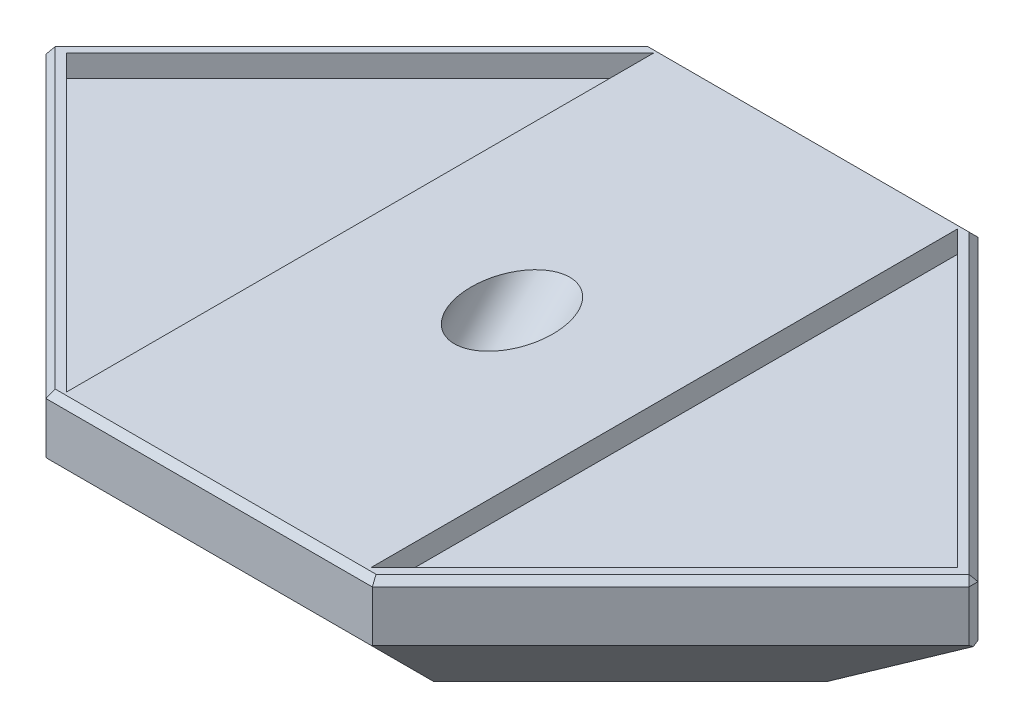
ISO-10303-21;
HEADER;
FILE_DESCRIPTION(('STEP AP214'),'2;1');
FILE_NAME('part.step','',(''),(''),'','','');
FILE_SCHEMA(('AUTOMOTIVE_DESIGN { 1 0 10303 214 1 1 1 1 }'));
ENDSEC;
DATA;
#1=APPLICATION_CONTEXT('core data for automotive mechanical design processes');
#2=APPLICATION_PROTOCOL_DEFINITION('international standard','automotive_design',2000,#1);
#3=PRODUCT_CONTEXT('',#1,'mechanical');
#4=PRODUCT('Part','Part','',(#3));
#5=PRODUCT_RELATED_PRODUCT_CATEGORY('part','',(#4));
#6=PRODUCT_DEFINITION_FORMATION('','',#4);
#7=PRODUCT_DEFINITION_CONTEXT('part definition',#1,'design');
#8=PRODUCT_DEFINITION('design','',#6,#7);
#9=PRODUCT_DEFINITION_SHAPE('','',#8);
#10=(LENGTH_UNIT() NAMED_UNIT(*) SI_UNIT(.MILLI.,.METRE.));
#11=(NAMED_UNIT(*) PLANE_ANGLE_UNIT() SI_UNIT($,.RADIAN.));
#12=(NAMED_UNIT(*) SI_UNIT($,.STERADIAN.) SOLID_ANGLE_UNIT());
#13=UNCERTAINTY_MEASURE_WITH_UNIT(LENGTH_MEASURE(1.E-05),#10,'distance_accuracy_value','');
#14=(GEOMETRIC_REPRESENTATION_CONTEXT(3) GLOBAL_UNCERTAINTY_ASSIGNED_CONTEXT((#13)) GLOBAL_UNIT_ASSIGNED_CONTEXT((#10,
#11,#12)) REPRESENTATION_CONTEXT('',''));
#15=CARTESIAN_POINT('',(0.,0.,0.));
#16=DIRECTION('',(0.,0.,1.));
#17=DIRECTION('',(1.,0.,0.));
#18=AXIS2_PLACEMENT_3D('',#15,#16,#17);
#19=CARTESIAN_POINT('',(0.,50.8,0.));
#20=DIRECTION('',(0.,1.,0.));
#21=DIRECTION('',(0.,0.,1.));
#22=AXIS2_PLACEMENT_3D('',#19,#20,#21);
#23=PLANE('',#22);
#24=CARTESIAN_POINT('',(0.,50.8,25.4000000000001));
#25=DIRECTION('',(0.,1.,0.));
#26=DIRECTION('',(0.,0.,1.));
#27=AXIS2_PLACEMENT_3D('',#24,#25,#26);
#28=ELLIPSE('',#27,5.3881536726415,3.81);
#29=CARTESIAN_POINT('',(-0.57424923983971,50.8,30.7266007566823));
#30=VERTEX_POINT('',#29);
#31=CARTESIAN_POINT('',(0.574249239839723,50.8,30.7266007566823));
#32=VERTEX_POINT('',#31);
#33=EDGE_CURVE('E12',#30,#32,#28,.F.);
#34=ORIENTED_EDGE('',*,*,#33,.F.);
#35=DIRECTION('',(1.,0.,0.));
#36=VECTOR('',#35,1.);
#37=CARTESIAN_POINT('',(0.,50.8,30.7266007566823));
#38=LINE('',#37,#36);
#39=CARTESIAN_POINT('',(-18.4710779641509,50.8,30.7266007566823));
#40=VERTEX_POINT('',#39);
#41=EDGE_CURVE('E215',#40,#30,#38,.T.);
#42=ORIENTED_EDGE('',*,*,#41,.F.);
#43=DIRECTION('',(-0.707106781186547,0.,-0.707106781186548));
#44=VECTOR('',#43,1.);
#45=CARTESIAN_POINT('',(-24.5988393604166,50.8,24.5988393604166));
#46=LINE('',#45,#44);
#47=CARTESIAN_POINT('',(-49.1976787208332,50.8,0.));
#48=VERTEX_POINT('',#47);
#49=EDGE_CURVE('E257',#40,#48,#46,.T.);
#50=ORIENTED_EDGE('',*,*,#49,.T.);
#51=DIRECTION('',(0.707106781186548,0.,-0.707106781186547));
#52=VECTOR('',#51,1.);
#53=CARTESIAN_POINT('',(-24.5988393604166,50.8,-24.5988393604166));
#54=LINE('',#53,#52);
#55=CARTESIAN_POINT('',(-18.4710779641509,50.8,-30.7266007566823));
#56=VERTEX_POINT('',#55);
#57=EDGE_CURVE('E254',#48,#56,#54,.T.);
#58=ORIENTED_EDGE('',*,*,#57,.T.);
#59=DIRECTION('',(-1.,0.,0.));
#60=VECTOR('',#59,1.);
#61=CARTESIAN_POINT('',(0.,50.8,-30.7266007566823));
#62=LINE('',#61,#60);
#63=CARTESIAN_POINT('',(18.4710779641509,50.8,-30.7266007566823));
#64=VERTEX_POINT('',#63);
#65=EDGE_CURVE('E290',#64,#56,#62,.T.);
#66=ORIENTED_EDGE('',*,*,#65,.F.);
#67=DIRECTION('',(0.707106781186547,0.,0.707106781186548));
#68=VECTOR('',#67,1.);
#69=CARTESIAN_POINT('',(24.5988393604166,50.8,-24.5988393604166));
#70=LINE('',#69,#68);
#71=CARTESIAN_POINT('',(49.1976787208331,50.8,0.));
#72=VERTEX_POINT('',#71);
#73=EDGE_CURVE('E249',#64,#72,#70,.T.);
#74=ORIENTED_EDGE('',*,*,#73,.T.);
#75=DIRECTION('',(-0.707106781186548,0.,0.707106781186547));
#76=VECTOR('',#75,1.);
#77=CARTESIAN_POINT('',(24.5988393604166,50.8,24.5988393604166));
#78=LINE('',#77,#76);
#79=CARTESIAN_POINT('',(18.4710779641509,50.8,30.7266007566823));
#80=VERTEX_POINT('',#79);
#81=EDGE_CURVE('E221',#72,#80,#78,.T.);
#82=ORIENTED_EDGE('',*,*,#81,.T.);
#83=EDGE_CURVE('E213',#32,#80,#38,.T.);
#84=ORIENTED_EDGE('',*,*,#83,.F.);
#85=EDGE_LOOP('',(#34,#42,#50,#58,#66,#74,#82,#84));
#86=FACE_BOUND('',#85,.T.);
#87=ADVANCED_FACE('F47',(#86),#23,.F.);
#88=CARTESIAN_POINT('',(0.,99.7731723178066,-23.5731723178066));
#89=DIRECTION('',(0.,-0.707106781186546,0.707106781186549));
#90=DIRECTION('',(0.,-0.707106781186549,-0.707106781186546));
#91=AXIS2_PLACEMENT_3D('',#88,#89,#90);
#92=CYLINDRICAL_SURFACE('',#91,1.905);
#93=CARTESIAN_POINT('',(0.,57.1169557427281,19.083044257272));
#94=DIRECTION('',(0.,0.707106781186546,-0.707106781186549));
#95=DIRECTION('',(0.,0.707106781186549,0.707106781186546));
#96=AXIS2_PLACEMENT_3D('',#93,#94,#95);
#97=CIRCLE('',#96,1.905);
#98=CARTESIAN_POINT('',(0.,58.4639941608884,20.4300826754324));
#99=VERTEX_POINT('',#98);
#100=EDGE_CURVE('E218',#99,#99,#97,.T.);
#101=ORIENTED_EDGE('',*,*,#100,.F.);
#102=EDGE_LOOP('',(#101));
#103=FACE_BOUND('',#102,.T.);
#104=CARTESIAN_POINT('',(0.,66.0972118637972,10.1027881362029));
#105=DIRECTION('',(0.,0.707106781186546,-0.707106781186549));
#106=DIRECTION('',(0.,0.707106781186549,0.707106781186546));
#107=AXIS2_PLACEMENT_3D('',#104,#105,#106);
#108=CIRCLE('',#107,1.905);
#109=CARTESIAN_POINT('',(0.,67.4442502819576,11.4498265543632));
#110=VERTEX_POINT('',#109);
#111=EDGE_CURVE('E396',#110,#110,#108,.T.);
#112=ORIENTED_EDGE('',*,*,#111,.T.);
#113=EDGE_LOOP('',(#112));
#114=FACE_BOUND('',#113,.T.);
#115=ADVANCED_FACE('F560',(#103,#114),#92,.F.);
#116=CARTESIAN_POINT('',(-72.5463446356131,76.2,0.));
#117=DIRECTION('',(0.707106781186547,0.,0.707106781186548));
#118=DIRECTION('',(0.707106781186548,0.,-0.707106781186547));
#119=AXIS2_PLACEMENT_3D('',#116,#117,#118);
#120=PLANE('',#119);
#121=DIRECTION('',(-0.707106781186548,0.,0.707106781186547));
#122=VECTOR('',#121,1.);
#123=CARTESIAN_POINT('',(-72.5463446356131,67.31,0.));
#124=LINE('',#123,#122);
#125=CARTESIAN_POINT('',(-25.4,67.31,-47.146344635613));
#126=VERTEX_POINT('',#125);
#127=CARTESIAN_POINT('',(-71.8392378544265,67.31,-0.707106781186533));
#128=VERTEX_POINT('',#127);
#129=EDGE_CURVE('E261',#126,#128,#124,.T.);
#130=ORIENTED_EDGE('',*,*,#129,.T.);
#131=DIRECTION('',(0.,1.,0.));
#132=VECTOR('',#131,1.);
#133=CARTESIAN_POINT('',(-71.8392378544265,76.2,-0.707106781186533));
#134=LINE('',#133,#132);
#135=CARTESIAN_POINT('',(-71.8392378544265,75.2,-0.707106781186533));
#136=VERTEX_POINT('',#135);
#137=EDGE_CURVE('E311',#128,#136,#134,.T.);
#138=ORIENTED_EDGE('',*,*,#137,.T.);
#139=DIRECTION('',(0.707106781186548,0.,-0.707106781186547));
#140=VECTOR('',#139,1.);
#141=CARTESIAN_POINT('',(-72.5463446356131,75.2,0.));
#142=LINE('',#141,#140);
#143=CARTESIAN_POINT('',(-25.4,75.2,-47.146344635613));
#144=VERTEX_POINT('',#143);
#145=EDGE_CURVE('E308',#136,#144,#142,.T.);
#146=ORIENTED_EDGE('',*,*,#145,.T.);
#147=DIRECTION('',(0.,-1.,0.));
#148=VECTOR('',#147,1.);
#149=CARTESIAN_POINT('',(-25.4,76.2,-47.146344635613));
#150=LINE('',#149,#148);
#151=EDGE_CURVE('E450',#144,#126,#150,.T.);
#152=ORIENTED_EDGE('',*,*,#151,.T.);
#153=EDGE_LOOP('',(#130,#138,#146,#152));
#154=FACE_BOUND('',#153,.T.);
#155=ADVANCED_FACE('F546',(#154),#120,.F.);
#156=CARTESIAN_POINT('',(-25.4,76.2,47.1463446356131));
#157=DIRECTION('',(0.707106781186548,0.,-0.707106781186547));
#158=DIRECTION('',(-0.707106781186547,0.,-0.707106781186548));
#159=AXIS2_PLACEMENT_3D('',#156,#157,#158);
#160=PLANE('',#159);
#161=DIRECTION('',(-0.707106781186547,0.,-0.707106781186548));
#162=VECTOR('',#161,1.);
#163=CARTESIAN_POINT('',(-25.4,75.2,47.1463446356131));
#164=LINE('',#163,#162);
#165=CARTESIAN_POINT('',(-25.4,75.2,47.1463446356131));
#166=VERTEX_POINT('',#165);
#167=CARTESIAN_POINT('',(-71.8392378544265,75.2,0.707106781186519));
#168=VERTEX_POINT('',#167);
#169=EDGE_CURVE('E286',#166,#168,#164,.T.);
#170=ORIENTED_EDGE('',*,*,#169,.T.);
#171=DIRECTION('',(0.,-1.,0.));
#172=VECTOR('',#171,1.);
#173=CARTESIAN_POINT('',(-71.8392378544265,76.2,0.707106781186524));
#174=LINE('',#173,#172);
#175=CARTESIAN_POINT('',(-71.8392378544265,67.31,0.707106781186517));
#176=VERTEX_POINT('',#175);
#177=EDGE_CURVE('E298',#168,#176,#174,.T.);
#178=ORIENTED_EDGE('',*,*,#177,.T.);
#179=DIRECTION('',(0.707106781186547,0.,0.707106781186548));
#180=VECTOR('',#179,1.);
#181=CARTESIAN_POINT('',(-25.4,67.31,47.1463446356131));
#182=LINE('',#181,#180);
#183=CARTESIAN_POINT('',(-25.4,67.31,47.1463446356131));
#184=VERTEX_POINT('',#183);
#185=EDGE_CURVE('E228',#176,#184,#182,.T.);
#186=ORIENTED_EDGE('',*,*,#185,.T.);
#187=DIRECTION('',(0.,-1.,0.));
#188=VECTOR('',#187,1.);
#189=CARTESIAN_POINT('',(-25.4,76.2,47.1463446356131));
#190=LINE('',#189,#188);
#191=EDGE_CURVE('E224',#166,#184,#190,.T.);
#192=ORIENTED_EDGE('',*,*,#191,.F.);
#193=EDGE_LOOP('',(#170,#178,#186,#192));
#194=FACE_BOUND('',#193,.T.);
#195=ADVANCED_FACE('F490',(#194),#160,.F.);
#196=CARTESIAN_POINT('',(25.4,76.2,47.1463446356131));
#197=DIRECTION('',(0.,0.,-1.));
#198=DIRECTION('',(-1.,0.,0.));
#199=AXIS2_PLACEMENT_3D('',#196,#197,#198);
#200=PLANE('',#199);
#201=DIRECTION('',(0.,-1.,0.));
#202=VECTOR('',#201,1.);
#203=CARTESIAN_POINT('',(25.4,76.2,47.1463446356131));
#204=LINE('',#203,#202);
#205=CARTESIAN_POINT('',(25.4,75.2,47.1463446356131));
#206=VERTEX_POINT('',#205);
#207=CARTESIAN_POINT('',(25.4,67.31,47.1463446356131));
#208=VERTEX_POINT('',#207);
#209=EDGE_CURVE('E229',#206,#208,#204,.T.);
#210=ORIENTED_EDGE('',*,*,#209,.F.);
#211=DIRECTION('',(-1.,0.,0.));
#212=VECTOR('',#211,1.);
#213=CARTESIAN_POINT('',(25.4,75.2,47.1463446356131));
#214=LINE('',#213,#212);
#215=EDGE_CURVE('E351',#206,#166,#214,.T.);
#216=ORIENTED_EDGE('',*,*,#215,.T.);
#217=ORIENTED_EDGE('',*,*,#191,.T.);
#218=DIRECTION('',(-0.816496580927727,0.577350269189624,0.));
#219=VECTOR('',#218,1.);
#220=CARTESIAN_POINT('',(-25.4,67.31,47.1463446356131));
#221=LINE('',#220,#219);
#222=CARTESIAN_POINT('',(-25.2723585694968,67.2197438789308,47.1463446356131));
#223=VERTEX_POINT('',#222);
#224=EDGE_CURVE('E240',#184,#223,#221,.F.);
#225=ORIENTED_EDGE('',*,*,#224,.T.);
#226=DIRECTION('',(1.,0.,0.));
#227=VECTOR('',#226,1.);
#228=CARTESIAN_POINT('',(25.4,67.2197438789308,47.1463446356131));
#229=LINE('',#228,#227);
#230=CARTESIAN_POINT('',(25.2723585694968,67.2197438789308,47.1463446356131));
#231=VERTEX_POINT('',#230);
#232=EDGE_CURVE('E442',#223,#231,#229,.T.);
#233=ORIENTED_EDGE('',*,*,#232,.T.);
#234=DIRECTION('',(-0.816496580927728,-0.577350269189624,0.));
#235=VECTOR('',#234,1.);
#236=CARTESIAN_POINT('',(56.8308964237422,89.535,47.1463446356131));
#237=LINE('',#236,#235);
#238=EDGE_CURVE('E236',#231,#208,#237,.F.);
#239=ORIENTED_EDGE('',*,*,#238,.T.);
#240=EDGE_LOOP('',(#210,#216,#217,#225,#233,#239));
#241=FACE_BOUND('',#240,.T.);
#242=ADVANCED_FACE('F465',(#241),#200,.F.);
#243=CARTESIAN_POINT('',(72.5463446356131,76.2,0.));
#244=DIRECTION('',(-0.707106781186547,0.,-0.707106781186548));
#245=DIRECTION('',(-0.707106781186548,0.,0.707106781186547));
#246=AXIS2_PLACEMENT_3D('',#243,#244,#245);
#247=PLANE('',#246);
#248=DIRECTION('',(0.707106781186548,0.,-0.707106781186547));
#249=VECTOR('',#248,1.);
#250=CARTESIAN_POINT('',(72.5463446356131,67.31,0.));
#251=LINE('',#250,#249);
#252=CARTESIAN_POINT('',(71.8392378544265,67.31,0.707106781186547));
#253=VERTEX_POINT('',#252);
#254=EDGE_CURVE('E278',#208,#253,#251,.T.);
#255=ORIENTED_EDGE('',*,*,#254,.T.);
#256=DIRECTION('',(0.,1.,0.));
#257=VECTOR('',#256,1.);
#258=CARTESIAN_POINT('',(71.8392378544265,76.2,0.707106781186547));
#259=LINE('',#258,#257);
#260=CARTESIAN_POINT('',(71.8392378544265,75.2,0.707106781186547));
#261=VERTEX_POINT('',#260);
#262=EDGE_CURVE('E329',#253,#261,#259,.T.);
#263=ORIENTED_EDGE('',*,*,#262,.T.);
#264=DIRECTION('',(-0.707106781186548,0.,0.707106781186547));
#265=VECTOR('',#264,1.);
#266=CARTESIAN_POINT('',(72.5463446356131,75.2,0.));
#267=LINE('',#266,#265);
#268=EDGE_CURVE('E326',#261,#206,#267,.T.);
#269=ORIENTED_EDGE('',*,*,#268,.T.);
#270=ORIENTED_EDGE('',*,*,#209,.T.);
#271=EDGE_LOOP('',(#255,#263,#269,#270));
#272=FACE_BOUND('',#271,.T.);
#273=ADVANCED_FACE('F458',(#272),#247,.F.);
#274=CARTESIAN_POINT('',(25.4,76.2,-47.1463446356131));
#275=DIRECTION('',(-0.707106781186548,0.,0.707106781186547));
#276=DIRECTION('',(0.707106781186547,0.,0.707106781186548));
#277=AXIS2_PLACEMENT_3D('',#274,#275,#276);
#278=PLANE('',#277);
#279=DIRECTION('',(0.707106781186547,0.,0.707106781186548));
#280=VECTOR('',#279,1.);
#281=CARTESIAN_POINT('',(25.4,75.2,-47.1463446356131));
#282=LINE('',#281,#280);
#283=CARTESIAN_POINT('',(25.4,75.2,-47.1463446356131));
#284=VERTEX_POINT('',#283);
#285=CARTESIAN_POINT('',(71.8392378544265,75.2,-0.707106781186505));
#286=VERTEX_POINT('',#285);
#287=EDGE_CURVE('E314',#284,#286,#282,.T.);
#288=ORIENTED_EDGE('',*,*,#287,.T.);
#289=DIRECTION('',(0.,-1.,0.));
#290=VECTOR('',#289,1.);
#291=CARTESIAN_POINT('',(71.8392378544265,76.2,-0.70710678118651));
#292=LINE('',#291,#290);
#293=CARTESIAN_POINT('',(71.8392378544265,67.31,-0.707106781186503));
#294=VERTEX_POINT('',#293);
#295=EDGE_CURVE('E317',#286,#294,#292,.T.);
#296=ORIENTED_EDGE('',*,*,#295,.T.);
#297=DIRECTION('',(-0.707106781186547,0.,-0.707106781186548));
#298=VECTOR('',#297,1.);
#299=CARTESIAN_POINT('',(25.4,67.31,-47.1463446356131));
#300=LINE('',#299,#298);
#301=CARTESIAN_POINT('',(25.4,67.31,-47.1463446356131));
#302=VERTEX_POINT('',#301);
#303=EDGE_CURVE('E282',#294,#302,#300,.T.);
#304=ORIENTED_EDGE('',*,*,#303,.T.);
#305=DIRECTION('',(0.,-1.,0.));
#306=VECTOR('',#305,1.);
#307=CARTESIAN_POINT('',(25.4,76.2,-47.1463446356131));
#308=LINE('',#307,#306);
#309=EDGE_CURVE('E453',#284,#302,#308,.T.);
#310=ORIENTED_EDGE('',*,*,#309,.F.);
#311=EDGE_LOOP('',(#288,#296,#304,#310));
#312=FACE_BOUND('',#311,.T.);
#313=ADVANCED_FACE('F507',(#312),#278,.F.);
#314=CARTESIAN_POINT('',(-25.4,76.2,-47.146344635613));
#315=DIRECTION('',(0.,0.,1.));
#316=DIRECTION('',(1.,0.,0.));
#317=AXIS2_PLACEMENT_3D('',#314,#315,#316);
#318=PLANE('',#317);
#319=ORIENTED_EDGE('',*,*,#151,.F.);
#320=DIRECTION('',(1.,0.,0.));
#321=VECTOR('',#320,1.);
#322=CARTESIAN_POINT('',(-25.4,75.2,-47.146344635613));
#323=LINE('',#322,#321);
#324=EDGE_CURVE('E57',#144,#284,#323,.T.);
#325=ORIENTED_EDGE('',*,*,#324,.T.);
#326=ORIENTED_EDGE('',*,*,#309,.T.);
#327=DIRECTION('',(0.816496580927727,0.577350269189624,0.));
#328=VECTOR('',#327,1.);
#329=CARTESIAN_POINT('',(25.4,67.31,-47.1463446356131));
#330=LINE('',#329,#328);
#331=CARTESIAN_POINT('',(25.2723585694968,67.2197438789308,-47.1463446356131));
#332=VERTEX_POINT('',#331);
#333=EDGE_CURVE('E271',#302,#332,#330,.F.);
#334=ORIENTED_EDGE('',*,*,#333,.T.);
#335=DIRECTION('',(-1.,0.,0.));
#336=VECTOR('',#335,1.);
#337=CARTESIAN_POINT('',(-25.4,67.2197438789308,-47.146344635613));
#338=LINE('',#337,#336);
#339=CARTESIAN_POINT('',(-25.2723585694968,67.2197438789308,-47.146344635613));
#340=VERTEX_POINT('',#339);
#341=EDGE_CURVE('E446',#332,#340,#338,.T.);
#342=ORIENTED_EDGE('',*,*,#341,.T.);
#343=DIRECTION('',(0.816496580927727,-0.577350269189624,0.));
#344=VECTOR('',#343,1.);
#345=CARTESIAN_POINT('',(-56.8308964237421,89.535,-47.146344635613));
#346=LINE('',#345,#344);
#347=EDGE_CURVE('E274',#340,#126,#346,.F.);
#348=ORIENTED_EDGE('',*,*,#347,.T.);
#349=EDGE_LOOP('',(#319,#325,#326,#334,#342,#348));
#350=FACE_BOUND('',#349,.T.);
#351=ADVANCED_FACE('F544',(#350),#318,.F.);
#352=CARTESIAN_POINT('',(0.,76.2,0.));
#353=DIRECTION('',(0.,-1.,0.));
#354=DIRECTION('',(0.,0.,-1.));
#355=AXIS2_PLACEMENT_3D('',#352,#353,#354);
#356=PLANE('',#355);
#357=CARTESIAN_POINT('',(0.,76.2,0.));
#358=DIRECTION('',(0.,-1.,0.));
#359=DIRECTION('',(0.,0.,1.));
#360=AXIS2_PLACEMENT_3D('',#357,#358,#359);
#361=ELLIPSE('',#360,8.98025612106917,6.35);
#362=CARTESIAN_POINT('',(0.,76.2,8.98025612106919));
#363=VERTEX_POINT('',#362);
#364=EDGE_CURVE('E399',#363,#363,#361,.F.);
#365=ORIENTED_EDGE('',*,*,#364,.F.);
#366=EDGE_LOOP('',(#365));
#367=FACE_BOUND('',#366,.T.);
#368=DIRECTION('',(-0.707106781186548,0.,0.707106781186547));
#369=VECTOR('',#368,1.);
#370=CARTESIAN_POINT('',(-23.6827588496726,76.2,-45.681605270601));
#371=LINE('',#370,#369);
#372=CARTESIAN_POINT('',(-23.6827588496726,76.2,-45.681605270601));
#373=VERTEX_POINT('',#372);
#374=CARTESIAN_POINT('',(-69.3643641202736,76.2,0.));
#375=VERTEX_POINT('',#374);
#376=EDGE_CURVE('E996',#373,#375,#371,.T.);
#377=ORIENTED_EDGE('',*,*,#376,.F.);
#378=DIRECTION('',(-5.98392186298375E-08,0.,-0.999999999999998));
#379=VECTOR('',#378,1.);
#380=CARTESIAN_POINT('',(-23.6827533825691,76.2,45.6816107377041));
#381=LINE('',#380,#379);
#382=CARTESIAN_POINT('',(-23.6827533825691,76.2,45.6816107377041));
#383=VERTEX_POINT('',#382);
#384=EDGE_CURVE('E70',#383,#373,#381,.T.);
#385=ORIENTED_EDGE('',*,*,#384,.F.);
#386=DIRECTION('',(0.70710678118655,0.,0.707106781186545));
#387=VECTOR('',#386,1.);
#388=CARTESIAN_POINT('',(-69.3643641202736,76.2,0.));
#389=LINE('',#388,#387);
#390=EDGE_CURVE('E985',#375,#383,#389,.T.);
#391=ORIENTED_EDGE('',*,*,#390,.F.);
#392=EDGE_LOOP('',(#377,#385,#391));
#393=FACE_BOUND('',#392,.T.);
#394=DIRECTION('',(-0.70710678118655,0.,-0.707106781186545));
#395=VECTOR('',#394,1.);
#396=CARTESIAN_POINT('',(69.3643641202737,76.2,0.));
#397=LINE('',#396,#395);
#398=CARTESIAN_POINT('',(69.3643641202737,76.2,0.));
#399=VERTEX_POINT('',#398);
#400=CARTESIAN_POINT('',(23.6827561990909,76.2,-45.6816079211824));
#401=VERTEX_POINT('',#400);
#402=EDGE_CURVE('E420',#399,#401,#397,.T.);
#403=ORIENTED_EDGE('',*,*,#402,.F.);
#404=DIRECTION('',(0.707106781186547,0.,-0.707106781186548));
#405=VECTOR('',#404,1.);
#406=CARTESIAN_POINT('',(23.6827452224931,76.2,45.6816188977806));
#407=LINE('',#406,#405);
#408=CARTESIAN_POINT('',(23.6827452224931,76.2,45.6816188977806));
#409=VERTEX_POINT('',#408);
#410=EDGE_CURVE('E425',#409,#399,#407,.T.);
#411=ORIENTED_EDGE('',*,*,#410,.F.);
#412=DIRECTION('',(-1.20142404341E-07,0.,0.999999999999993));
#413=VECTOR('',#412,1.);
#414=CARTESIAN_POINT('',(23.6827561990909,76.2,-45.6816079211824));
#415=LINE('',#414,#413);
#416=EDGE_CURVE('E417',#401,#409,#415,.T.);
#417=ORIENTED_EDGE('',*,*,#416,.F.);
#418=EDGE_LOOP('',(#403,#411,#417));
#419=FACE_BOUND('',#418,.T.);
#420=DIRECTION('',(1.,0.,0.));
#421=VECTOR('',#420,1.);
#422=CARTESIAN_POINT('',(0.,76.2,46.1463446356131));
#423=LINE('',#422,#421);
#424=CARTESIAN_POINT('',(-24.9857864376269,76.2,46.1463446356131));
#425=VERTEX_POINT('',#424);
#426=CARTESIAN_POINT('',(24.9857864376269,76.2,46.1463446356131));
#427=VERTEX_POINT('',#426);
#428=EDGE_CURVE('E344',#425,#427,#423,.T.);
#429=ORIENTED_EDGE('',*,*,#428,.T.);
#430=DIRECTION('',(0.707106781186548,0.,-0.707106781186547));
#431=VECTOR('',#430,1.);
#432=CARTESIAN_POINT('',(35.56606553662,76.2,35.56606553662));
#433=LINE('',#432,#431);
#434=CARTESIAN_POINT('',(71.13213107324,76.2,0.));
#435=VERTEX_POINT('',#434);
#436=EDGE_CURVE('E347',#427,#435,#433,.T.);
#437=ORIENTED_EDGE('',*,*,#436,.T.);
#438=DIRECTION('',(-0.707106781186547,0.,-0.707106781186548));
#439=VECTOR('',#438,1.);
#440=CARTESIAN_POINT('',(35.56606553662,76.2,-35.56606553662));
#441=LINE('',#440,#439);
#442=CARTESIAN_POINT('',(24.9857864376269,76.2,-46.1463446356131));
#443=VERTEX_POINT('',#442);
#444=EDGE_CURVE('E332',#435,#443,#441,.T.);
#445=ORIENTED_EDGE('',*,*,#444,.T.);
#446=DIRECTION('',(-1.,0.,0.));
#447=VECTOR('',#446,1.);
#448=CARTESIAN_POINT('',(0.,76.2,-46.1463446356131));
#449=LINE('',#448,#447);
#450=CARTESIAN_POINT('',(-24.9857864376269,76.2,-46.1463446356131));
#451=VERTEX_POINT('',#450);
#452=EDGE_CURVE('E335',#443,#451,#449,.T.);
#453=ORIENTED_EDGE('',*,*,#452,.T.);
#454=DIRECTION('',(-0.707106781186548,0.,0.707106781186547));
#455=VECTOR('',#454,1.);
#456=CARTESIAN_POINT('',(-35.56606553662,76.2,-35.56606553662));
#457=LINE('',#456,#455);
#458=CARTESIAN_POINT('',(-71.13213107324,76.2,0.));
#459=VERTEX_POINT('',#458);
#460=EDGE_CURVE('E338',#451,#459,#457,.T.);
#461=ORIENTED_EDGE('',*,*,#460,.T.);
#462=DIRECTION('',(0.707106781186547,0.,0.707106781186548));
#463=VECTOR('',#462,1.);
#464=CARTESIAN_POINT('',(-35.56606553662,76.2,35.56606553662));
#465=LINE('',#464,#463);
#466=EDGE_CURVE('E341',#459,#425,#465,.T.);
#467=ORIENTED_EDGE('',*,*,#466,.T.);
#468=EDGE_LOOP('',(#429,#437,#445,#453,#461,#467));
#469=FACE_BOUND('',#468,.T.);
#470=ADVANCED_FACE('F519',(#367,#393,#419,#469),#356,.F.);
#471=CARTESIAN_POINT('',(0.,10.0366996216588,10.0366996216588));
#472=DIRECTION('',(0.,0.707106781186546,0.707106781186549));
#473=DIRECTION('',(0.,-0.707106781186549,0.707106781186546));
#474=AXIS2_PLACEMENT_3D('',#471,#472,#473);
#475=PLANE('',#474);
#476=ORIENTED_EDGE('',*,*,#65,.T.);
#477=DIRECTION('',(0.281084637714826,-0.678598344545847,0.678598344545845));
#478=VECTOR('',#477,1.);
#479=CARTESIAN_POINT('',(-20.0317624695153,54.5678256994361,-34.4944264561184));
#480=LINE('',#479,#478);
#481=EDGE_CURVE('E268',#56,#340,#480,.F.);
#482=ORIENTED_EDGE('',*,*,#481,.T.);
#483=ORIENTED_EDGE('',*,*,#341,.F.);
#484=DIRECTION('',(0.281084637714827,0.678598344545847,-0.678598344545844));
#485=VECTOR('',#484,1.);
#486=CARTESIAN_POINT('',(25.2996591115797,67.2856532178875,-47.2122539745698));
#487=LINE('',#486,#485);
#488=EDGE_CURVE('E265',#332,#64,#487,.F.);
#489=ORIENTED_EDGE('',*,*,#488,.T.);
#490=EDGE_LOOP('',(#476,#482,#483,#489));
#491=FACE_BOUND('',#490,.T.);
#492=ADVANCED_FACE('F540',(#491),#475,.F.);
#493=CARTESIAN_POINT('',(0.,10.0366996216588,-10.0366996216588));
#494=DIRECTION('',(0.,0.707106781186546,-0.707106781186549));
#495=DIRECTION('',(0.,0.707106781186549,0.707106781186546));
#496=AXIS2_PLACEMENT_3D('',#493,#494,#495);
#497=PLANE('',#496);
#498=CARTESIAN_POINT('',(0.,48.1366996216589,28.0633003783412));
#499=DIRECTION('',(0.,0.707106781186546,-0.707106781186549));
#500=DIRECTION('',(0.,0.707106781186549,0.707106781186546));
#501=AXIS2_PLACEMENT_3D('',#498,#499,#500);
#502=CIRCLE('',#501,3.81);
#503=EDGE_CURVE('E62',#30,#32,#502,.T.);
#504=ORIENTED_EDGE('',*,*,#503,.T.);
#505=ORIENTED_EDGE('',*,*,#83,.T.);
#506=DIRECTION('',(-0.281084637714827,-0.678598344545847,-0.678598344545844));
#507=VECTOR('',#506,1.);
#508=CARTESIAN_POINT('',(20.0317624695153,54.5678256994362,34.4944264561185));
#509=LINE('',#508,#507);
#510=EDGE_CURVE('E243',#80,#231,#509,.F.);
#511=ORIENTED_EDGE('',*,*,#510,.T.);
#512=ORIENTED_EDGE('',*,*,#232,.F.);
#513=DIRECTION('',(-0.281084637714827,0.678598344545847,0.678598344545844));
#514=VECTOR('',#513,1.);
#515=CARTESIAN_POINT('',(-25.2996591115797,67.2856532178875,47.2122539745698));
#516=LINE('',#515,#514);
#517=EDGE_CURVE('E246',#223,#40,#516,.F.);
#518=ORIENTED_EDGE('',*,*,#517,.T.);
#519=ORIENTED_EDGE('',*,*,#41,.T.);
#520=EDGE_LOOP('',(#504,#505,#511,#512,#518,#519));
#521=FACE_BOUND('',#520,.T.);
#522=ADVANCED_FACE('F212',(#521),#497,.F.);
#523=CARTESIAN_POINT('',(-72.5463446356131,67.31,0.));
#524=DIRECTION('',(0.499999999999999,0.707106781186549,0.499999999999999));
#525=DIRECTION('',(-0.707106781186548,0.,0.707106781186547));
#526=AXIS2_PLACEMENT_3D('',#523,#524,#525);
#527=PLANE('',#526);
#528=DIRECTION('',(-0.816496580927727,0.577350269189624,0.));
#529=VECTOR('',#528,1.);
#530=CARTESIAN_POINT('',(-72.5463446356131,67.31,0.));
#531=LINE('',#530,#529);
#532=CARTESIAN_POINT('',(-71.8392378544265,66.81,0.));
#533=VERTEX_POINT('',#532);
#534=EDGE_CURVE('E287',#533,#48,#531,.F.);
#535=ORIENTED_EDGE('',*,*,#534,.F.);
#536=DIRECTION('',(0.,0.577350269189625,-0.816496580927727));
#537=VECTOR('',#536,1.);
#538=CARTESIAN_POINT('',(-71.8392378544265,66.9766666666667,-0.235702260395511));
#539=LINE('',#538,#537);
#540=EDGE_CURVE('E305',#533,#128,#539,.T.);
#541=ORIENTED_EDGE('',*,*,#540,.T.);
#542=ORIENTED_EDGE('',*,*,#129,.F.);
#543=ORIENTED_EDGE('',*,*,#347,.F.);
#544=ORIENTED_EDGE('',*,*,#481,.F.);
#545=ORIENTED_EDGE('',*,*,#57,.F.);
#546=EDGE_LOOP('',(#535,#541,#542,#543,#544,#545));
#547=FACE_BOUND('',#546,.T.);
#548=ADVANCED_FACE('F534',(#547),#527,.F.);
#549=CARTESIAN_POINT('',(-25.4,67.31,47.1463446356131));
#550=DIRECTION('',(0.499999999999999,0.707106781186549,-0.499999999999999));
#551=DIRECTION('',(0.707106781186547,0.,0.707106781186548));
#552=AXIS2_PLACEMENT_3D('',#549,#550,#551);
#553=PLANE('',#552);
#554=ORIENTED_EDGE('',*,*,#185,.F.);
#555=DIRECTION('',(0.,-0.577350269189624,-0.816496580927727));
#556=VECTOR('',#555,1.);
#557=CARTESIAN_POINT('',(-71.8392378544265,89.2016666666667,31.6665986841376));
#558=LINE('',#557,#556);
#559=EDGE_CURVE('E302',#176,#533,#558,.T.);
#560=ORIENTED_EDGE('',*,*,#559,.T.);
#561=ORIENTED_EDGE('',*,*,#534,.T.);
#562=ORIENTED_EDGE('',*,*,#49,.F.);
#563=ORIENTED_EDGE('',*,*,#517,.F.);
#564=ORIENTED_EDGE('',*,*,#224,.F.);
#565=EDGE_LOOP('',(#554,#560,#561,#562,#563,#564));
#566=FACE_BOUND('',#565,.T.);
#567=ADVANCED_FACE('F497',(#566),#553,.F.);
#568=CARTESIAN_POINT('',(25.4,67.31,-47.1463446356131));
#569=DIRECTION('',(-0.499999999999999,0.707106781186549,0.499999999999999));
#570=DIRECTION('',(-0.707106781186547,0.,-0.707106781186548));
#571=AXIS2_PLACEMENT_3D('',#568,#569,#570);
#572=PLANE('',#571);
#573=ORIENTED_EDGE('',*,*,#303,.F.);
#574=DIRECTION('',(0.,-0.577350269189624,0.816496580927727));
#575=VECTOR('',#574,1.);
#576=CARTESIAN_POINT('',(71.8392378544265,89.2016666666667,-31.6665986841376));
#577=LINE('',#576,#575);
#578=CARTESIAN_POINT('',(71.8392378544265,66.81,0.));
#579=VERTEX_POINT('',#578);
#580=EDGE_CURVE('E320',#294,#579,#577,.T.);
#581=ORIENTED_EDGE('',*,*,#580,.T.);
#582=DIRECTION('',(-0.816496580927727,-0.577350269189624,0.));
#583=VECTOR('',#582,1.);
#584=CARTESIAN_POINT('',(41.1154482118709,45.085,0.));
#585=LINE('',#584,#583);
#586=EDGE_CURVE('E291',#72,#579,#585,.F.);
#587=ORIENTED_EDGE('',*,*,#586,.F.);
#588=ORIENTED_EDGE('',*,*,#73,.F.);
#589=ORIENTED_EDGE('',*,*,#488,.F.);
#590=ORIENTED_EDGE('',*,*,#333,.F.);
#591=EDGE_LOOP('',(#573,#581,#587,#588,#589,#590));
#592=FACE_BOUND('',#591,.T.);
#593=ADVANCED_FACE('F502',(#592),#572,.F.);
#594=CARTESIAN_POINT('',(72.5463446356131,67.31,0.));
#595=DIRECTION('',(-0.499999999999999,0.707106781186549,-0.499999999999999));
#596=DIRECTION('',(0.707106781186548,0.,-0.707106781186547));
#597=AXIS2_PLACEMENT_3D('',#594,#595,#596);
#598=PLANE('',#597);
#599=ORIENTED_EDGE('',*,*,#586,.T.);
#600=DIRECTION('',(0.,0.577350269189624,0.816496580927727));
#601=VECTOR('',#600,1.);
#602=CARTESIAN_POINT('',(71.8392378544265,66.9766666666667,0.235702260395525));
#603=LINE('',#602,#601);
#604=EDGE_CURVE('E323',#579,#253,#603,.T.);
#605=ORIENTED_EDGE('',*,*,#604,.T.);
#606=ORIENTED_EDGE('',*,*,#254,.F.);
#607=ORIENTED_EDGE('',*,*,#238,.F.);
#608=ORIENTED_EDGE('',*,*,#510,.F.);
#609=ORIENTED_EDGE('',*,*,#81,.F.);
#610=EDGE_LOOP('',(#599,#605,#606,#607,#608,#609));
#611=FACE_BOUND('',#610,.T.);
#612=ADVANCED_FACE('F468',(#611),#598,.F.);
#613=CARTESIAN_POINT('',(71.8392378544265,76.2,-0.70710678118651));
#614=DIRECTION('',(-1.,0.,0.));
#615=DIRECTION('',(0.,-1.,0.));
#616=AXIS2_PLACEMENT_3D('',#613,#614,#615);
#617=PLANE('',#616);
#618=DIRECTION('',(0.,0.,1.));
#619=VECTOR('',#618,1.);
#620=CARTESIAN_POINT('',(71.8392378544265,75.2,0.707106781186547));
#621=LINE('',#620,#619);
#622=EDGE_CURVE('E295',#261,#286,#621,.F.);
#623=ORIENTED_EDGE('',*,*,#622,.F.);
#624=ORIENTED_EDGE('',*,*,#262,.F.);
#625=ORIENTED_EDGE('',*,*,#604,.F.);
#626=ORIENTED_EDGE('',*,*,#580,.F.);
#627=ORIENTED_EDGE('',*,*,#295,.F.);
#628=EDGE_LOOP('',(#623,#624,#625,#626,#627));
#629=FACE_BOUND('',#628,.T.);
#630=ADVANCED_FACE('F50',(#629),#617,.F.);
#631=CARTESIAN_POINT('',(71.8392378544265,75.2,0.707106781186547));
#632=DIRECTION('',(0.816496580927732,0.577350269189617,0.));
#633=DIRECTION('',(-0.577350269189617,0.816496580927732,0.));
#634=AXIS2_PLACEMENT_3D('',#631,#632,#633);
#635=PLANE('',#634);
#636=DIRECTION('',(-0.499999999999994,0.70710678118655,-0.500000000000003));
#637=VECTOR('',#636,1.);
#638=CARTESIAN_POINT('',(71.8392378544265,75.2,0.707106781186552));
#639=LINE('',#638,#637);
#640=EDGE_CURVE('E385',#261,#435,#639,.T.);
#641=ORIENTED_EDGE('',*,*,#640,.F.);
#642=ORIENTED_EDGE('',*,*,#622,.T.);
#643=DIRECTION('',(0.499999999999985,-0.707106781186547,-0.500000000000015));
#644=VECTOR('',#643,1.);
#645=CARTESIAN_POINT('',(71.4856844638333,75.7,-0.353553390593228));
#646=LINE('',#645,#644);
#647=EDGE_CURVE('E389',#435,#286,#646,.T.);
#648=ORIENTED_EDGE('',*,*,#647,.F.);
#649=EDGE_LOOP('',(#641,#642,#648));
#650=FACE_BOUND('',#649,.T.);
#651=ADVANCED_FACE('F478',(#650),#635,.T.);
#652=CARTESIAN_POINT('',(35.56606553662,76.2,-35.56606553662));
#653=DIRECTION('',(-0.5,-0.707106781186548,0.5));
#654=DIRECTION('',(-0.707106781186547,0.,-0.707106781186548));
#655=AXIS2_PLACEMENT_3D('',#652,#653,#654);
#656=PLANE('',#655);
#657=ORIENTED_EDGE('',*,*,#647,.T.);
#658=ORIENTED_EDGE('',*,*,#287,.F.);
#659=DIRECTION('',(-0.281084637714828,0.678598344545849,0.678598344545842));
#660=VECTOR('',#659,1.);
#661=CARTESIAN_POINT('',(23.8035989919519,79.0540529646158,-43.2922916709973));
#662=LINE('',#661,#660);
#663=EDGE_CURVE('E381',#443,#284,#662,.F.);
#664=ORIENTED_EDGE('',*,*,#663,.F.);
#665=ORIENTED_EDGE('',*,*,#444,.F.);
#666=EDGE_LOOP('',(#657,#658,#664,#665));
#667=FACE_BOUND('',#666,.T.);
#668=ADVANCED_FACE('F511',(#667),#656,.F.);
#669=CARTESIAN_POINT('',(35.56606553662,76.2,35.56606553662));
#670=DIRECTION('',(-0.500000000000002,-0.707106781186545,-0.500000000000002));
#671=DIRECTION('',(0.707106781186548,0.,-0.707106781186547));
#672=AXIS2_PLACEMENT_3D('',#669,#670,#671);
#673=PLANE('',#672);
#674=ORIENTED_EDGE('',*,*,#640,.T.);
#675=ORIENTED_EDGE('',*,*,#436,.F.);
#676=DIRECTION('',(-0.281084637714822,0.67859834454585,-0.678598344545843));
#677=VECTOR('',#676,1.);
#678=CARTESIAN_POINT('',(23.0116950919334,80.9658781001366,41.3804665354765));
#679=LINE('',#678,#677);
#680=EDGE_CURVE('E377',#206,#427,#679,.T.);
#681=ORIENTED_EDGE('',*,*,#680,.F.);
#682=ORIENTED_EDGE('',*,*,#268,.F.);
#683=EDGE_LOOP('',(#674,#675,#681,#682));
#684=FACE_BOUND('',#683,.T.);
#685=ADVANCED_FACE('F481',(#684),#673,.F.);
#686=CARTESIAN_POINT('',(0.,76.2,-46.1463446356131));
#687=DIRECTION('',(0.,-0.707106781186544,0.707106781186551));
#688=DIRECTION('',(-1.,0.,0.));
#689=AXIS2_PLACEMENT_3D('',#686,#687,#688);
#690=PLANE('',#689);
#691=ORIENTED_EDGE('',*,*,#663,.T.);
#692=ORIENTED_EDGE('',*,*,#324,.F.);
#693=DIRECTION('',(0.281084637714819,0.678598344545851,0.678598344545844));
#694=VECTOR('',#693,1.);
#695=CARTESIAN_POINT('',(-23.0116950919334,80.9658781001366,-41.3804665354765));
#696=LINE('',#695,#694);
#697=EDGE_CURVE('E373',#451,#144,#696,.F.);
#698=ORIENTED_EDGE('',*,*,#697,.F.);
#699=ORIENTED_EDGE('',*,*,#452,.F.);
#700=EDGE_LOOP('',(#691,#692,#698,#699));
#701=FACE_BOUND('',#700,.T.);
#702=ADVANCED_FACE('F515',(#701),#690,.F.);
#703=CARTESIAN_POINT('',(0.,76.2,46.1463446356131));
#704=DIRECTION('',(0.,-0.707106781186544,-0.707106781186551));
#705=DIRECTION('',(1.,0.,0.));
#706=AXIS2_PLACEMENT_3D('',#703,#704,#705);
#707=PLANE('',#706);
#708=ORIENTED_EDGE('',*,*,#680,.T.);
#709=ORIENTED_EDGE('',*,*,#428,.F.);
#710=DIRECTION('',(0.281084637714824,0.67859834454585,-0.678598344545843));
#711=VECTOR('',#710,1.);
#712=CARTESIAN_POINT('',(-23.8035989919519,79.0540529646158,43.2922916709973));
#713=LINE('',#712,#711);
#714=EDGE_CURVE('E369',#166,#425,#713,.T.);
#715=ORIENTED_EDGE('',*,*,#714,.F.);
#716=ORIENTED_EDGE('',*,*,#215,.F.);
#717=EDGE_LOOP('',(#708,#709,#715,#716));
#718=FACE_BOUND('',#717,.T.);
#719=ADVANCED_FACE('F486',(#718),#707,.F.);
#720=CARTESIAN_POINT('',(-35.56606553662,76.2,-35.56606553662));
#721=DIRECTION('',(0.500000000000003,-0.707106781186544,0.500000000000003));
#722=DIRECTION('',(-0.707106781186548,0.,0.707106781186547));
#723=AXIS2_PLACEMENT_3D('',#720,#721,#722);
#724=PLANE('',#723);
#725=ORIENTED_EDGE('',*,*,#697,.T.);
#726=ORIENTED_EDGE('',*,*,#145,.F.);
#727=DIRECTION('',(0.500000000000004,0.707106781186551,0.49999999999999));
#728=VECTOR('',#727,1.);
#729=CARTESIAN_POINT('',(-71.8392378544265,75.2,-0.707106781186528));
#730=LINE('',#729,#728);
#731=EDGE_CURVE('E365',#459,#136,#730,.F.);
#732=ORIENTED_EDGE('',*,*,#731,.F.);
#733=ORIENTED_EDGE('',*,*,#460,.F.);
#734=EDGE_LOOP('',(#725,#726,#732,#733));
#735=FACE_BOUND('',#734,.T.);
#736=ADVANCED_FACE('F549',(#735),#724,.F.);
#737=CARTESIAN_POINT('',(-35.56606553662,76.2,35.56606553662));
#738=DIRECTION('',(0.500000000000001,-0.707106781186546,-0.500000000000001));
#739=DIRECTION('',(0.707106781186547,0.,0.707106781186548));
#740=AXIS2_PLACEMENT_3D('',#737,#738,#739);
#741=PLANE('',#740);
#742=ORIENTED_EDGE('',*,*,#714,.T.);
#743=ORIENTED_EDGE('',*,*,#466,.F.);
#744=DIRECTION('',(-0.500000000000003,-0.70710678118655,0.499999999999994));
#745=VECTOR('',#744,1.);
#746=CARTESIAN_POINT('',(-71.4856844638333,75.7,0.35355339059327));
#747=LINE('',#746,#745);
#748=EDGE_CURVE('E360',#168,#459,#747,.F.);
#749=ORIENTED_EDGE('',*,*,#748,.F.);
#750=ORIENTED_EDGE('',*,*,#169,.F.);
#751=EDGE_LOOP('',(#742,#743,#749,#750));
#752=FACE_BOUND('',#751,.T.);
#753=ADVANCED_FACE('F522',(#752),#741,.F.);
#754=CARTESIAN_POINT('',(-71.8392378544265,75.2,-0.707106781186533));
#755=DIRECTION('',(-0.816496580927725,0.577350269189627,0.));
#756=DIRECTION('',(-0.577350269189627,-0.816496580927725,0.));
#757=AXIS2_PLACEMENT_3D('',#754,#755,#756);
#758=PLANE('',#757);
#759=ORIENTED_EDGE('',*,*,#748,.T.);
#760=ORIENTED_EDGE('',*,*,#731,.T.);
#761=DIRECTION('',(0.,0.,-1.));
#762=VECTOR('',#761,1.);
#763=CARTESIAN_POINT('',(-71.8392378544265,75.2,-0.707106781186533));
#764=LINE('',#763,#762);
#765=EDGE_CURVE('E356',#168,#136,#764,.T.);
#766=ORIENTED_EDGE('',*,*,#765,.F.);
#767=EDGE_LOOP('',(#759,#760,#766));
#768=FACE_BOUND('',#767,.T.);
#769=ADVANCED_FACE('F526',(#768),#758,.T.);
#770=CARTESIAN_POINT('',(-71.8392378544265,76.2,0.707106781186524));
#771=DIRECTION('',(1.,0.,0.));
#772=DIRECTION('',(0.,-1.,0.));
#773=AXIS2_PLACEMENT_3D('',#770,#771,#772);
#774=PLANE('',#773);
#775=ORIENTED_EDGE('',*,*,#765,.T.);
#776=ORIENTED_EDGE('',*,*,#137,.F.);
#777=ORIENTED_EDGE('',*,*,#540,.F.);
#778=ORIENTED_EDGE('',*,*,#559,.F.);
#779=ORIENTED_EDGE('',*,*,#177,.F.);
#780=EDGE_LOOP('',(#775,#776,#777,#778,#779));
#781=FACE_BOUND('',#780,.T.);
#782=ADVANCED_FACE('F529',(#781),#774,.F.);
#783=CARTESIAN_POINT('',(23.6827452224931,72.775,45.6816188977806));
#784=DIRECTION('',(0.707106781186548,0.,0.707106781186547));
#785=DIRECTION('',(0.707106781186547,0.,-0.707106781186548));
#786=AXIS2_PLACEMENT_3D('',#783,#784,#785);
#787=PLANE('',#786);
#788=ORIENTED_EDGE('',*,*,#410,.T.);
#789=DIRECTION('',(0.,1.,0.));
#790=VECTOR('',#789,1.);
#791=CARTESIAN_POINT('',(69.3643641202737,72.775,0.));
#792=LINE('',#791,#790);
#793=CARTESIAN_POINT('',(69.3643641202737,72.775,0.));
#794=VERTEX_POINT('',#793);
#795=EDGE_CURVE('E413',#794,#399,#792,.T.);
#796=ORIENTED_EDGE('',*,*,#795,.F.);
#797=DIRECTION('',(0.707106781186547,0.,-0.707106781186548));
#798=VECTOR('',#797,1.);
#799=CARTESIAN_POINT('',(23.6827452224931,72.775,45.6816188977806));
#800=LINE('',#799,#798);
#801=CARTESIAN_POINT('',(23.6827452224931,72.775,45.6816188977806));
#802=VERTEX_POINT('',#801);
#803=EDGE_CURVE('E421',#802,#794,#800,.T.);
#804=ORIENTED_EDGE('',*,*,#803,.F.);
#805=DIRECTION('',(0.,1.,0.));
#806=VECTOR('',#805,1.);
#807=CARTESIAN_POINT('',(23.6827452224931,72.775,45.6816188977806));
#808=LINE('',#807,#806);
#809=EDGE_CURVE('E403',#802,#409,#808,.T.);
#810=ORIENTED_EDGE('',*,*,#809,.T.);
#811=EDGE_LOOP('',(#788,#796,#804,#810));
#812=FACE_BOUND('',#811,.T.);
#813=ADVANCED_FACE('F616',(#812),#787,.F.);
#814=CARTESIAN_POINT('',(23.6827561990909,72.775,-45.6816079211824));
#815=DIRECTION('',(-0.999999999999993,0.,-1.20142404341E-07));
#816=DIRECTION('',(-1.20142404341E-07,0.,0.999999999999993));
#817=AXIS2_PLACEMENT_3D('',#814,#815,#816);
#818=PLANE('',#817);
#819=ORIENTED_EDGE('',*,*,#416,.T.);
#820=ORIENTED_EDGE('',*,*,#809,.F.);
#821=DIRECTION('',(-1.20142404341E-07,0.,0.999999999999993));
#822=VECTOR('',#821,1.);
#823=CARTESIAN_POINT('',(23.6827561990909,72.775,-45.6816079211824));
#824=LINE('',#823,#822);
#825=CARTESIAN_POINT('',(23.6827561990909,72.775,-45.6816079211824));
#826=VERTEX_POINT('',#825);
#827=EDGE_CURVE('E428',#826,#802,#824,.T.);
#828=ORIENTED_EDGE('',*,*,#827,.F.);
#829=DIRECTION('',(0.,1.,0.));
#830=VECTOR('',#829,1.);
#831=CARTESIAN_POINT('',(23.6827561990909,72.775,-45.6816079211824));
#832=LINE('',#831,#830);
#833=EDGE_CURVE('E407',#826,#401,#832,.T.);
#834=ORIENTED_EDGE('',*,*,#833,.T.);
#835=EDGE_LOOP('',(#819,#820,#828,#834));
#836=FACE_BOUND('',#835,.T.);
#837=ADVANCED_FACE('F784',(#836),#818,.F.);
#838=CARTESIAN_POINT('',(69.3643641202737,72.775,0.));
#839=DIRECTION('',(0.707106781186545,0.,-0.70710678118655));
#840=DIRECTION('',(-0.70710678118655,0.,-0.707106781186545));
#841=AXIS2_PLACEMENT_3D('',#838,#839,#840);
#842=PLANE('',#841);
#843=ORIENTED_EDGE('',*,*,#402,.T.);
#844=ORIENTED_EDGE('',*,*,#833,.F.);
#845=DIRECTION('',(-0.70710678118655,0.,-0.707106781186545));
#846=VECTOR('',#845,1.);
#847=CARTESIAN_POINT('',(69.3643641202737,72.775,0.));
#848=LINE('',#847,#846);
#849=EDGE_CURVE('E432',#794,#826,#848,.T.);
#850=ORIENTED_EDGE('',*,*,#849,.F.);
#851=ORIENTED_EDGE('',*,*,#795,.T.);
#852=EDGE_LOOP('',(#843,#844,#850,#851));
#853=FACE_BOUND('',#852,.T.);
#854=ADVANCED_FACE('F777',(#853),#842,.F.);
#855=CARTESIAN_POINT('',(0.,72.775,0.));
#856=DIRECTION('',(0.,1.,0.));
#857=DIRECTION('',(0.,0.,1.));
#858=AXIS2_PLACEMENT_3D('',#855,#856,#857);
#859=PLANE('',#858);
#860=ORIENTED_EDGE('',*,*,#803,.T.);
#861=ORIENTED_EDGE('',*,*,#849,.T.);
#862=ORIENTED_EDGE('',*,*,#827,.T.);
#863=EDGE_LOOP('',(#860,#861,#862));
#864=FACE_BOUND('',#863,.T.);
#865=ADVANCED_FACE('F569',(#864),#859,.T.);
#866=CARTESIAN_POINT('',(-23.6827533825691,72.775,45.6816107377041));
#867=DIRECTION('',(0.999999999999998,0.,-5.98392186298375E-08));
#868=DIRECTION('',(-5.98392186298375E-08,0.,-0.999999999999998));
#869=AXIS2_PLACEMENT_3D('',#866,#867,#868);
#870=PLANE('',#869);
#871=ORIENTED_EDGE('',*,*,#384,.T.);
#872=DIRECTION('',(0.,1.,0.));
#873=VECTOR('',#872,1.);
#874=CARTESIAN_POINT('',(-23.6827588496726,72.775,-45.681605270601));
#875=LINE('',#874,#873);
#876=CARTESIAN_POINT('',(-23.6827588496726,72.775,-45.681605270601));
#877=VERTEX_POINT('',#876);
#878=EDGE_CURVE('E993',#877,#373,#875,.T.);
#879=ORIENTED_EDGE('',*,*,#878,.F.);
#880=DIRECTION('',(-5.98392186298375E-08,0.,-0.999999999999998));
#881=VECTOR('',#880,1.);
#882=CARTESIAN_POINT('',(-23.6827533825691,72.775,45.6816107377041));
#883=LINE('',#882,#881);
#884=CARTESIAN_POINT('',(-23.6827533825691,72.775,45.6816107377041));
#885=VERTEX_POINT('',#884);
#886=EDGE_CURVE('E980',#885,#877,#883,.T.);
#887=ORIENTED_EDGE('',*,*,#886,.F.);
#888=DIRECTION('',(0.,1.,0.));
#889=VECTOR('',#888,1.);
#890=CARTESIAN_POINT('',(-23.6827533825691,72.775,45.6816107377041));
#891=LINE('',#890,#889);
#892=EDGE_CURVE('E361',#885,#383,#891,.T.);
#893=ORIENTED_EDGE('',*,*,#892,.T.);
#894=EDGE_LOOP('',(#871,#879,#887,#893));
#895=FACE_BOUND('',#894,.T.);
#896=ADVANCED_FACE('F763',(#895),#870,.F.);
#897=CARTESIAN_POINT('',(-69.3643641202736,72.775,0.));
#898=DIRECTION('',(-0.707106781186545,0.,0.70710678118655));
#899=DIRECTION('',(0.70710678118655,0.,0.707106781186545));
#900=AXIS2_PLACEMENT_3D('',#897,#898,#899);
#901=PLANE('',#900);
#902=ORIENTED_EDGE('',*,*,#390,.T.);
#903=ORIENTED_EDGE('',*,*,#892,.F.);
#904=DIRECTION('',(0.70710678118655,0.,0.707106781186545));
#905=VECTOR('',#904,1.);
#906=CARTESIAN_POINT('',(-69.3643641202736,72.775,0.));
#907=LINE('',#906,#905);
#908=CARTESIAN_POINT('',(-69.3643641202736,72.775,0.));
#909=VERTEX_POINT('',#908);
#910=EDGE_CURVE('E989',#909,#885,#907,.T.);
#911=ORIENTED_EDGE('',*,*,#910,.F.);
#912=DIRECTION('',(0.,1.,0.));
#913=VECTOR('',#912,1.);
#914=CARTESIAN_POINT('',(-69.3643641202736,72.775,0.));
#915=LINE('',#914,#913);
#916=EDGE_CURVE('E1005',#909,#375,#915,.T.);
#917=ORIENTED_EDGE('',*,*,#916,.T.);
#918=EDGE_LOOP('',(#902,#903,#911,#917));
#919=FACE_BOUND('',#918,.T.);
#920=ADVANCED_FACE('F755',(#919),#901,.F.);
#921=CARTESIAN_POINT('',(-23.6827588496726,72.775,-45.681605270601));
#922=DIRECTION('',(-0.707106781186547,0.,-0.707106781186548));
#923=DIRECTION('',(-0.707106781186548,0.,0.707106781186547));
#924=AXIS2_PLACEMENT_3D('',#921,#922,#923);
#925=PLANE('',#924);
#926=ORIENTED_EDGE('',*,*,#376,.T.);
#927=ORIENTED_EDGE('',*,*,#916,.F.);
#928=DIRECTION('',(-0.707106781186548,0.,0.707106781186547));
#929=VECTOR('',#928,1.);
#930=CARTESIAN_POINT('',(-23.6827588496726,72.775,-45.681605270601));
#931=LINE('',#930,#929);
#932=EDGE_CURVE('E984',#877,#909,#931,.T.);
#933=ORIENTED_EDGE('',*,*,#932,.F.);
#934=ORIENTED_EDGE('',*,*,#878,.T.);
#935=EDGE_LOOP('',(#926,#927,#933,#934));
#936=FACE_BOUND('',#935,.T.);
#937=ADVANCED_FACE('F747',(#936),#925,.F.);
#938=CARTESIAN_POINT('',(0.,72.775,0.));
#939=DIRECTION('',(0.,1.,0.));
#940=DIRECTION('',(0.,0.,1.));
#941=AXIS2_PLACEMENT_3D('',#938,#939,#940);
#942=PLANE('',#941);
#943=ORIENTED_EDGE('',*,*,#886,.T.);
#944=ORIENTED_EDGE('',*,*,#932,.T.);
#945=ORIENTED_EDGE('',*,*,#910,.T.);
#946=EDGE_LOOP('',(#943,#944,#945));
#947=FACE_BOUND('',#946,.T.);
#948=ADVANCED_FACE('F738',(#947),#942,.T.);
#949=CARTESIAN_POINT('',(0.,99.7731723178066,-23.5731723178066));
#950=DIRECTION('',(0.,-0.707106781186546,0.707106781186549));
#951=DIRECTION('',(0.,-0.707106781186549,-0.707106781186546));
#952=AXIS2_PLACEMENT_3D('',#949,#950,#951);
#953=CYLINDRICAL_SURFACE('',#952,6.35);
#954=CARTESIAN_POINT('',(0.,66.0972118637972,10.1027881362029));
#955=DIRECTION('',(0.,0.707106781186546,-0.707106781186549));
#956=DIRECTION('',(0.,0.707106781186549,0.707106781186546));
#957=AXIS2_PLACEMENT_3D('',#954,#955,#956);
#958=CIRCLE('',#957,6.35);
#959=CARTESIAN_POINT('',(0.,70.5873399243318,14.5929161967374));
#960=VERTEX_POINT('',#959);
#961=EDGE_CURVE('E400',#960,#960,#958,.T.);
#962=ORIENTED_EDGE('',*,*,#961,.F.);
#963=EDGE_LOOP('',(#962));
#964=FACE_BOUND('',#963,.T.);
#965=ORIENTED_EDGE('',*,*,#364,.T.);
#966=EDGE_LOOP('',(#965));
#967=FACE_BOUND('',#966,.T.);
#968=ADVANCED_FACE('F728',(#964,#967),#953,.F.);
#969=CARTESIAN_POINT('',(0.,66.0972118637972,10.1027881362029));
#970=DIRECTION('',(0.,0.707106781186546,-0.707106781186549));
#971=DIRECTION('',(0.,0.707106781186549,0.707106781186546));
#972=AXIS2_PLACEMENT_3D('',#969,#970,#971);
#973=PLANE('',#972);
#974=ORIENTED_EDGE('',*,*,#111,.F.);
#975=EDGE_LOOP('',(#974));
#976=FACE_BOUND('',#975,.T.);
#977=ORIENTED_EDGE('',*,*,#961,.T.);
#978=EDGE_LOOP('',(#977));
#979=FACE_BOUND('',#978,.T.);
#980=ADVANCED_FACE('F724',(#976,#979),#973,.T.);
#981=CARTESIAN_POINT('',(0.,57.1169557427281,19.083044257272));
#982=DIRECTION('',(0.,-0.707106781186546,0.707106781186549));
#983=DIRECTION('',(0.,-0.707106781186549,-0.707106781186546));
#984=AXIS2_PLACEMENT_3D('',#981,#982,#983);
#985=CYLINDRICAL_SURFACE('',#984,3.81);
#986=CARTESIAN_POINT('',(0.,57.1169557427281,19.083044257272));
#987=DIRECTION('',(0.,0.707106781186546,-0.707106781186549));
#988=DIRECTION('',(0.,0.707106781186549,0.707106781186546));
#989=AXIS2_PLACEMENT_3D('',#986,#987,#988);
#990=CIRCLE('',#989,3.81);
#991=CARTESIAN_POINT('',(0.,59.8110325790488,21.7771210935928));
#992=VERTEX_POINT('',#991);
#993=EDGE_CURVE('E217',#992,#992,#990,.T.);
#994=ORIENTED_EDGE('',*,*,#993,.T.);
#995=EDGE_LOOP('',(#994));
#996=FACE_BOUND('',#995,.T.);
#997=ORIENTED_EDGE('',*,*,#33,.T.);
#998=ORIENTED_EDGE('',*,*,#503,.F.);
#999=EDGE_LOOP('',(#997,#998));
#1000=FACE_BOUND('',#999,.T.);
#1001=ADVANCED_FACE('F206',(#996,#1000),#985,.F.);
#1002=CARTESIAN_POINT('',(0.,57.1169557427281,19.083044257272));
#1003=DIRECTION('',(0.,0.707106781186546,-0.707106781186549));
#1004=DIRECTION('',(0.,0.707106781186549,0.707106781186546));
#1005=AXIS2_PLACEMENT_3D('',#1002,#1003,#1004);
#1006=PLANE('',#1005);
#1007=ORIENTED_EDGE('',*,*,#993,.F.);
#1008=EDGE_LOOP('',(#1007));
#1009=FACE_BOUND('',#1008,.T.);
#1010=ORIENTED_EDGE('',*,*,#100,.T.);
#1011=EDGE_LOOP('',(#1010));
#1012=FACE_BOUND('',#1011,.T.);
#1013=ADVANCED_FACE('F961',(#1009,#1012),#1006,.F.);
#1014=CLOSED_SHELL('',(#87,#115,#155,#195,#242,#273,#313,#351,#470,#492,#522,#548,#567,#593,
#612,#630,#651,#668,#685,#702,#719,#736,#753,#769,#782,#813,#837,#854,#865,#896,#920,#937,#948,
#968,#980,#1001,#1013));
#1015=MANIFOLD_SOLID_BREP('B2',#1014);
#1016=ADVANCED_BREP_SHAPE_REPRESENTATION('',(#18,#1015),#14);
#1017=SHAPE_DEFINITION_REPRESENTATION(#9,#1016);
ENDSEC;
END-ISO-10303-21;
